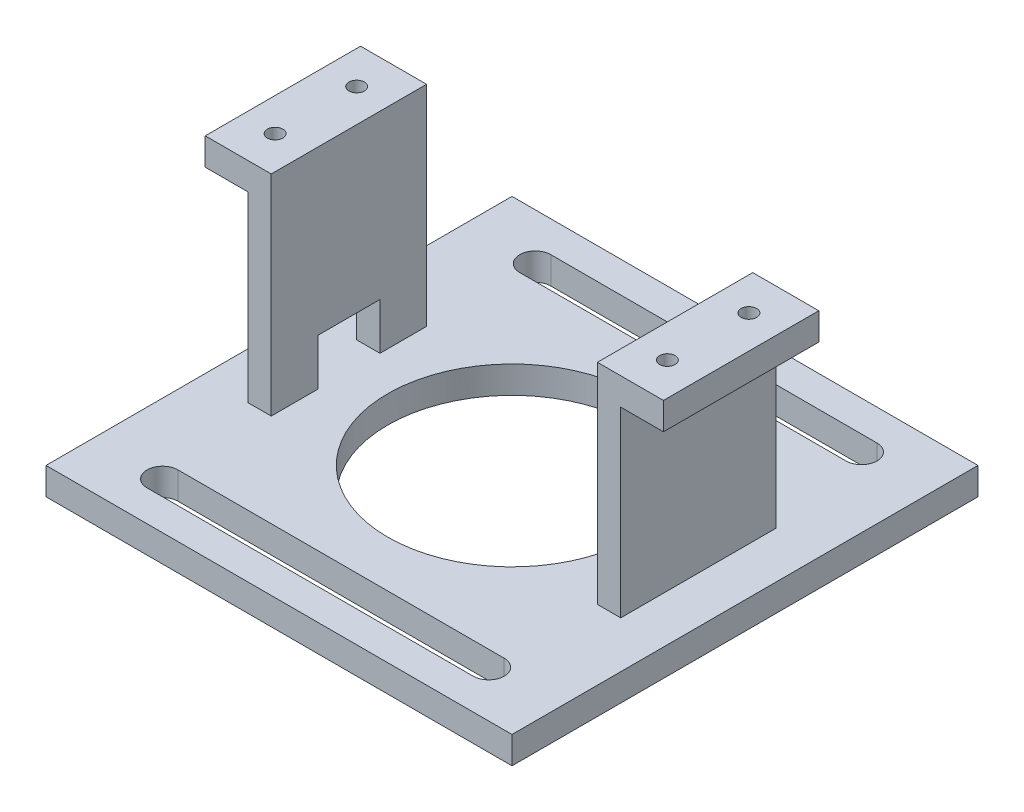
ISO-10303-21;
HEADER;
FILE_DESCRIPTION(('STEP AP214'),'2;1');
FILE_NAME('part.step','',(''),(''),'','','');
FILE_SCHEMA(('AUTOMOTIVE_DESIGN { 1 0 10303 214 1 1 1 1 }'));
ENDSEC;
DATA;
#1=APPLICATION_CONTEXT('core data for automotive mechanical design processes');
#2=APPLICATION_PROTOCOL_DEFINITION('international standard','automotive_design',2000,#1);
#3=PRODUCT_CONTEXT('',#1,'mechanical');
#4=PRODUCT('Part','Part','',(#3));
#5=PRODUCT_RELATED_PRODUCT_CATEGORY('part','',(#4));
#6=PRODUCT_DEFINITION_FORMATION('','',#4);
#7=PRODUCT_DEFINITION_CONTEXT('part definition',#1,'design');
#8=PRODUCT_DEFINITION('design','',#6,#7);
#9=PRODUCT_DEFINITION_SHAPE('','',#8);
#10=(LENGTH_UNIT() NAMED_UNIT(*) SI_UNIT(.MILLI.,.METRE.));
#11=(NAMED_UNIT(*) PLANE_ANGLE_UNIT() SI_UNIT($,.RADIAN.));
#12=(NAMED_UNIT(*) SI_UNIT($,.STERADIAN.) SOLID_ANGLE_UNIT());
#13=UNCERTAINTY_MEASURE_WITH_UNIT(LENGTH_MEASURE(1.E-05),#10,'distance_accuracy_value','');
#14=(GEOMETRIC_REPRESENTATION_CONTEXT(3) GLOBAL_UNCERTAINTY_ASSIGNED_CONTEXT((#13)) GLOBAL_UNIT_ASSIGNED_CONTEXT((#10,
#11,#12)) REPRESENTATION_CONTEXT('',''));
#15=CARTESIAN_POINT('',(0.,0.,0.));
#16=DIRECTION('',(0.,0.,1.));
#17=DIRECTION('',(1.,0.,0.));
#18=AXIS2_PLACEMENT_3D('',#15,#16,#17);
#19=CARTESIAN_POINT('',(-43.5898634281392,30.5,1.31023860830849));
#20=DIRECTION('',(1.,0.,0.));
#21=DIRECTION('',(0.,0.,-1.));
#22=AXIS2_PLACEMENT_3D('',#19,#20,#21);
#23=PLANE('',#22);
#24=DIRECTION('',(0.,0.,1.));
#25=VECTOR('',#24,1.);
#26=CARTESIAN_POINT('',(-43.5898634281392,3.5,1.31023860830849));
#27=LINE('',#26,#25);
#28=CARTESIAN_POINT('',(-43.5898634281392,3.5,-18.6897613916915));
#29=VERTEX_POINT('',#28);
#30=CARTESIAN_POINT('',(-43.5898634281392,3.5,-12.6897613916915));
#31=VERTEX_POINT('',#30);
#32=EDGE_CURVE('E241',#29,#31,#27,.T.);
#33=ORIENTED_EDGE('',*,*,#32,.T.);
#34=DIRECTION('',(0.,-1.,0.));
#35=VECTOR('',#34,1.);
#36=CARTESIAN_POINT('',(-43.5898634281392,9.5,-12.6897613916915));
#37=LINE('',#36,#35);
#38=CARTESIAN_POINT('',(-43.5898634281392,9.5,-12.6897613916915));
#39=VERTEX_POINT('',#38);
#40=EDGE_CURVE('E48',#39,#31,#37,.T.);
#41=ORIENTED_EDGE('',*,*,#40,.F.);
#42=DIRECTION('',(0.,0.,-1.));
#43=VECTOR('',#42,1.);
#44=CARTESIAN_POINT('',(-43.5898634281392,9.5,-4.68976139169151));
#45=LINE('',#44,#43);
#46=CARTESIAN_POINT('',(-43.5898634281392,9.5,-4.68976139169151));
#47=VERTEX_POINT('',#46);
#48=EDGE_CURVE('E234',#47,#39,#45,.T.);
#49=ORIENTED_EDGE('',*,*,#48,.F.);
#50=DIRECTION('',(0.,1.,0.));
#51=VECTOR('',#50,1.);
#52=CARTESIAN_POINT('',(-43.5898634281392,3.5,-4.68976139169151));
#53=LINE('',#52,#51);
#54=CARTESIAN_POINT('',(-43.5898634281392,3.5,-4.68976139169151));
#55=VERTEX_POINT('',#54);
#56=EDGE_CURVE('E220',#55,#47,#53,.T.);
#57=ORIENTED_EDGE('',*,*,#56,.F.);
#58=CARTESIAN_POINT('',(-43.5898634281392,3.5,1.31023860830849));
#59=VERTEX_POINT('',#58);
#60=EDGE_CURVE('E231',#55,#59,#27,.T.);
#61=ORIENTED_EDGE('',*,*,#60,.T.);
#62=DIRECTION('',(0.,-1.,0.));
#63=VECTOR('',#62,1.);
#64=CARTESIAN_POINT('',(-43.5898634281392,30.5,1.31023860830849));
#65=LINE('',#64,#63);
#66=CARTESIAN_POINT('',(-43.5898634281392,27.,1.31023860830849));
#67=VERTEX_POINT('',#66);
#68=EDGE_CURVE('E254',#67,#59,#65,.T.);
#69=ORIENTED_EDGE('',*,*,#68,.F.);
#70=DIRECTION('',(0.,0.,1.));
#71=VECTOR('',#70,1.);
#72=CARTESIAN_POINT('',(-43.5898634281392,27.,-18.6897613916915));
#73=LINE('',#72,#71);
#74=CARTESIAN_POINT('',(-43.5898634281392,27.,-18.6897613916915));
#75=VERTEX_POINT('',#74);
#76=EDGE_CURVE('E319',#75,#67,#73,.T.);
#77=ORIENTED_EDGE('',*,*,#76,.F.);
#78=DIRECTION('',(0.,-1.,0.));
#79=VECTOR('',#78,1.);
#80=CARTESIAN_POINT('',(-43.5898634281392,30.5,-18.6897613916915));
#81=LINE('',#80,#79);
#82=EDGE_CURVE('E257',#75,#29,#81,.T.);
#83=ORIENTED_EDGE('',*,*,#82,.T.);
#84=EDGE_LOOP('',(#33,#41,#49,#57,#61,#69,#77,#83));
#85=FACE_BOUND('',#84,.T.);
#86=ADVANCED_FACE('F33',(#85),#23,.F.);
#87=CARTESIAN_POINT('',(4.41013657186077,30.5,1.31023860830849));
#88=DIRECTION('',(-1.,0.,0.));
#89=DIRECTION('',(0.,0.,1.));
#90=AXIS2_PLACEMENT_3D('',#87,#88,#89);
#91=PLANE('',#90);
#92=DIRECTION('',(0.,0.,-1.));
#93=VECTOR('',#92,1.);
#94=CARTESIAN_POINT('',(4.41013657186077,27.,-18.6897613916915));
#95=LINE('',#94,#93);
#96=CARTESIAN_POINT('',(4.41013657186077,27.,1.31023860830849));
#97=VERTEX_POINT('',#96);
#98=CARTESIAN_POINT('',(4.41013657186077,27.,-18.6897613916915));
#99=VERTEX_POINT('',#98);
#100=EDGE_CURVE('E371',#97,#99,#95,.T.);
#101=ORIENTED_EDGE('',*,*,#100,.F.);
#102=DIRECTION('',(0.,-1.,0.));
#103=VECTOR('',#102,1.);
#104=CARTESIAN_POINT('',(4.41013657186077,30.5,1.31023860830849));
#105=LINE('',#104,#103);
#106=CARTESIAN_POINT('',(4.41013657186077,3.5,1.31023860830849));
#107=VERTEX_POINT('',#106);
#108=EDGE_CURVE('E454',#97,#107,#105,.T.);
#109=ORIENTED_EDGE('',*,*,#108,.T.);
#110=DIRECTION('',(0.,0.,-1.));
#111=VECTOR('',#110,1.);
#112=CARTESIAN_POINT('',(4.41013657186077,3.5,1.31023860830849));
#113=LINE('',#112,#111);
#114=CARTESIAN_POINT('',(4.41013657186077,3.5,-18.6897613916915));
#115=VERTEX_POINT('',#114);
#116=EDGE_CURVE('E445',#107,#115,#113,.T.);
#117=ORIENTED_EDGE('',*,*,#116,.T.);
#118=DIRECTION('',(0.,-1.,0.));
#119=VECTOR('',#118,1.);
#120=CARTESIAN_POINT('',(4.41013657186077,30.5,-18.6897613916915));
#121=LINE('',#120,#119);
#122=EDGE_CURVE('E452',#99,#115,#121,.T.);
#123=ORIENTED_EDGE('',*,*,#122,.F.);
#124=EDGE_LOOP('',(#101,#109,#117,#123));
#125=FACE_BOUND('',#124,.T.);
#126=ADVANCED_FACE('F502',(#125),#91,.F.);
#127=CARTESIAN_POINT('',(0.,3.5,0.));
#128=DIRECTION('',(0.,-1.,0.));
#129=DIRECTION('',(0.,0.,-1.));
#130=AXIS2_PLACEMENT_3D('',#127,#128,#129);
#131=PLANE('',#130);
#132=CARTESIAN_POINT('',(-19.5898634281392,3.5,-8.68976139169152));
#133=DIRECTION('',(0.,1.,0.));
#134=DIRECTION('',(0.,0.,1.));
#135=AXIS2_PLACEMENT_3D('',#132,#133,#134);
#136=CIRCLE('',#135,16.);
#137=CARTESIAN_POINT('',(-19.5898634281392,3.5,7.31023860830848));
#138=VERTEX_POINT('',#137);
#139=EDGE_CURVE('E298',#138,#138,#136,.T.);
#140=ORIENTED_EDGE('',*,*,#139,.F.);
#141=EDGE_LOOP('',(#140));
#142=FACE_BOUND('',#141,.T.);
#143=DIRECTION('',(-1.,0.,0.));
#144=VECTOR('',#143,1.);
#145=CARTESIAN_POINT('',(-33.5898634281392,3.5,-4.68976139169151));
#146=LINE('',#145,#144);
#147=CARTESIAN_POINT('',(-40.5898634281392,3.5,-4.68976139169151));
#148=VERTEX_POINT('',#147);
#149=EDGE_CURVE('E56',#148,#55,#146,.T.);
#150=ORIENTED_EDGE('',*,*,#149,.F.);
#151=DIRECTION('',(0.,0.,-1.));
#152=VECTOR('',#151,1.);
#153=CARTESIAN_POINT('',(-40.5898634281392,3.5,-18.6897613916915));
#154=LINE('',#153,#152);
#155=CARTESIAN_POINT('',(-40.5898634281392,3.5,1.31023860830849));
#156=VERTEX_POINT('',#155);
#157=EDGE_CURVE('E245',#156,#148,#154,.T.);
#158=ORIENTED_EDGE('',*,*,#157,.F.);
#159=DIRECTION('',(1.,0.,0.));
#160=VECTOR('',#159,1.);
#161=CARTESIAN_POINT('',(-40.5898634281392,3.5,1.31023860830849));
#162=LINE('',#161,#160);
#163=EDGE_CURVE('E240',#59,#156,#162,.T.);
#164=ORIENTED_EDGE('',*,*,#163,.F.);
#165=ORIENTED_EDGE('',*,*,#60,.F.);
#166=EDGE_LOOP('',(#150,#158,#164,#165));
#167=FACE_BOUND('',#166,.T.);
#168=DIRECTION('',(-1.,0.,0.));
#169=VECTOR('',#168,1.);
#170=CARTESIAN_POINT('',(-40.5898634281392,3.5,13.3102386083085));
#171=LINE('',#170,#169);
#172=CARTESIAN_POINT('',(1.41013657186077,3.5,13.3102386083085));
#173=VERTEX_POINT('',#172);
#174=CARTESIAN_POINT('',(-40.5898634281392,3.5,13.3102386083085));
#175=VERTEX_POINT('',#174);
#176=EDGE_CURVE('E391',#173,#175,#171,.T.);
#177=ORIENTED_EDGE('',*,*,#176,.F.);
#178=CARTESIAN_POINT('',(1.41013657186077,3.5,15.3102386083085));
#179=DIRECTION('',(0.,1.,0.));
#180=DIRECTION('',(0.,0.,1.));
#181=AXIS2_PLACEMENT_3D('',#178,#179,#180);
#182=CIRCLE('',#181,2.);
#183=CARTESIAN_POINT('',(1.41013657186077,3.5,17.3102386083085));
#184=VERTEX_POINT('',#183);
#185=EDGE_CURVE('E389',#184,#173,#182,.T.);
#186=ORIENTED_EDGE('',*,*,#185,.F.);
#187=DIRECTION('',(1.,0.,0.));
#188=VECTOR('',#187,1.);
#189=CARTESIAN_POINT('',(1.41013657186077,3.5,17.3102386083085));
#190=LINE('',#189,#188);
#191=CARTESIAN_POINT('',(-40.5898634281392,3.5,17.3102386083085));
#192=VERTEX_POINT('',#191);
#193=EDGE_CURVE('E397',#192,#184,#190,.T.);
#194=ORIENTED_EDGE('',*,*,#193,.F.);
#195=CARTESIAN_POINT('',(-40.5898634281392,3.5,15.3102386083085));
#196=DIRECTION('',(0.,1.,0.));
#197=DIRECTION('',(0.,0.,1.));
#198=AXIS2_PLACEMENT_3D('',#195,#196,#197);
#199=CIRCLE('',#198,2.);
#200=EDGE_CURVE('E394',#175,#192,#199,.T.);
#201=ORIENTED_EDGE('',*,*,#200,.F.);
#202=EDGE_LOOP('',(#177,#186,#194,#201));
#203=FACE_BOUND('',#202,.T.);
#204=DIRECTION('',(-1.,0.,0.));
#205=VECTOR('',#204,1.);
#206=CARTESIAN_POINT('',(1.41013657186077,3.5,-34.6897613916915));
#207=LINE('',#206,#205);
#208=CARTESIAN_POINT('',(1.41013657186077,3.5,-34.6897613916915));
#209=VERTEX_POINT('',#208);
#210=CARTESIAN_POINT('',(-40.5898634281392,3.5,-34.6897613916915));
#211=VERTEX_POINT('',#210);
#212=EDGE_CURVE('E411',#209,#211,#207,.T.);
#213=ORIENTED_EDGE('',*,*,#212,.F.);
#214=CARTESIAN_POINT('',(1.41013657186077,3.5,-32.6897613916915));
#215=DIRECTION('',(0.,1.,0.));
#216=DIRECTION('',(0.,0.,1.));
#217=AXIS2_PLACEMENT_3D('',#214,#215,#216);
#218=CIRCLE('',#217,2.);
#219=CARTESIAN_POINT('',(1.41013657186077,3.5,-30.6897613916915));
#220=VERTEX_POINT('',#219);
#221=EDGE_CURVE('E403',#220,#209,#218,.T.);
#222=ORIENTED_EDGE('',*,*,#221,.F.);
#223=DIRECTION('',(1.,0.,0.));
#224=VECTOR('',#223,1.);
#225=CARTESIAN_POINT('',(1.41013657186077,3.5,-30.6897613916915));
#226=LINE('',#225,#224);
#227=CARTESIAN_POINT('',(-40.5898634281392,3.5,-30.6897613916915));
#228=VERTEX_POINT('',#227);
#229=EDGE_CURVE('E417',#228,#220,#226,.T.);
#230=ORIENTED_EDGE('',*,*,#229,.F.);
#231=CARTESIAN_POINT('',(-40.5898634281392,3.5,-32.6897613916915));
#232=DIRECTION('',(0.,1.,0.));
#233=DIRECTION('',(0.,0.,1.));
#234=AXIS2_PLACEMENT_3D('',#231,#232,#233);
#235=CIRCLE('',#234,2.);
#236=EDGE_CURVE('E414',#211,#228,#235,.T.);
#237=ORIENTED_EDGE('',*,*,#236,.F.);
#238=EDGE_LOOP('',(#213,#222,#230,#237));
#239=FACE_BOUND('',#238,.T.);
#240=CARTESIAN_POINT('',(-40.5898634281392,3.5,-12.6897613916915));
#241=VERTEX_POINT('',#240);
#242=CARTESIAN_POINT('',(-40.5898634281392,3.5,-18.6897613916915));
#243=VERTEX_POINT('',#242);
#244=EDGE_CURVE('E459',#241,#243,#154,.T.);
#245=ORIENTED_EDGE('',*,*,#244,.F.);
#246=DIRECTION('',(-1.,0.,0.));
#247=VECTOR('',#246,1.);
#248=CARTESIAN_POINT('',(-33.5898634281392,3.5,-12.6897613916915));
#249=LINE('',#248,#247);
#250=EDGE_CURVE('E226',#241,#31,#249,.T.);
#251=ORIENTED_EDGE('',*,*,#250,.T.);
#252=ORIENTED_EDGE('',*,*,#32,.F.);
#253=DIRECTION('',(-1.,0.,0.));
#254=VECTOR('',#253,1.);
#255=CARTESIAN_POINT('',(-43.5898634281392,3.5,-18.6897613916915));
#256=LINE('',#255,#254);
#257=EDGE_CURVE('E242',#243,#29,#256,.T.);
#258=ORIENTED_EDGE('',*,*,#257,.F.);
#259=EDGE_LOOP('',(#245,#251,#252,#258));
#260=FACE_BOUND('',#259,.T.);
#261=DIRECTION('',(0.,0.,1.));
#262=VECTOR('',#261,1.);
#263=CARTESIAN_POINT('',(10.4101365718608,3.5,-38.6897613916915));
#264=LINE('',#263,#262);
#265=CARTESIAN_POINT('',(10.4101365718608,3.5,-38.6897613916915));
#266=VERTEX_POINT('',#265);
#267=CARTESIAN_POINT('',(10.4101365718608,3.5,21.3102386083085));
#268=VERTEX_POINT('',#267);
#269=EDGE_CURVE('E263',#266,#268,#264,.T.);
#270=ORIENTED_EDGE('',*,*,#269,.F.);
#271=DIRECTION('',(1.,0.,0.));
#272=VECTOR('',#271,1.);
#273=CARTESIAN_POINT('',(-49.5898634281392,3.5,-38.6897613916915));
#274=LINE('',#273,#272);
#275=CARTESIAN_POINT('',(-49.5898634281392,3.5,-38.6897613916915));
#276=VERTEX_POINT('',#275);
#277=EDGE_CURVE('E272',#276,#266,#274,.T.);
#278=ORIENTED_EDGE('',*,*,#277,.F.);
#279=DIRECTION('',(0.,0.,1.));
#280=VECTOR('',#279,1.);
#281=CARTESIAN_POINT('',(-49.5898634281392,3.5,-38.6897613916915));
#282=LINE('',#281,#280);
#283=CARTESIAN_POINT('',(-49.5898634281392,3.5,21.3102386083085));
#284=VERTEX_POINT('',#283);
#285=EDGE_CURVE('E270',#276,#284,#282,.T.);
#286=ORIENTED_EDGE('',*,*,#285,.T.);
#287=DIRECTION('',(-1.,0.,0.));
#288=VECTOR('',#287,1.);
#289=CARTESIAN_POINT('',(10.4101365718608,3.5,21.3102386083085));
#290=LINE('',#289,#288);
#291=EDGE_CURVE('E266',#268,#284,#290,.T.);
#292=ORIENTED_EDGE('',*,*,#291,.F.);
#293=EDGE_LOOP('',(#270,#278,#286,#292));
#294=FACE_BOUND('',#293,.T.);
#295=DIRECTION('',(0.,0.,1.));
#296=VECTOR('',#295,1.);
#297=CARTESIAN_POINT('',(1.41013657186077,3.5,-18.6897613916915));
#298=LINE('',#297,#296);
#299=CARTESIAN_POINT('',(1.41013657186077,3.5,-18.6897613916915));
#300=VERTEX_POINT('',#299);
#301=CARTESIAN_POINT('',(1.41013657186077,3.5,1.31023860830849));
#302=VERTEX_POINT('',#301);
#303=EDGE_CURVE('E297',#300,#302,#298,.T.);
#304=ORIENTED_EDGE('',*,*,#303,.F.);
#305=DIRECTION('',(-1.,0.,0.));
#306=VECTOR('',#305,1.);
#307=CARTESIAN_POINT('',(4.41013657186077,3.5,-18.6897613916915));
#308=LINE('',#307,#306);
#309=EDGE_CURVE('E435',#115,#300,#308,.T.);
#310=ORIENTED_EDGE('',*,*,#309,.F.);
#311=ORIENTED_EDGE('',*,*,#116,.F.);
#312=DIRECTION('',(1.,0.,0.));
#313=VECTOR('',#312,1.);
#314=CARTESIAN_POINT('',(1.41013657186077,3.5,1.31023860830849));
#315=LINE('',#314,#313);
#316=EDGE_CURVE('E442',#302,#107,#315,.T.);
#317=ORIENTED_EDGE('',*,*,#316,.F.);
#318=EDGE_LOOP('',(#304,#310,#311,#317));
#319=FACE_BOUND('',#318,.T.);
#320=ADVANCED_FACE('F237',(#142,#167,#203,#239,#260,#294,#319),#131,.F.);
#321=CARTESIAN_POINT('',(10.4101365718608,3.5,-38.6897613916915));
#322=DIRECTION('',(1.,0.,0.));
#323=DIRECTION('',(0.,0.,-1.));
#324=AXIS2_PLACEMENT_3D('',#321,#322,#323);
#325=PLANE('',#324);
#326=DIRECTION('',(0.,0.,1.));
#327=VECTOR('',#326,1.);
#328=CARTESIAN_POINT('',(10.4101365718608,0.,-38.6897613916915));
#329=LINE('',#328,#327);
#330=CARTESIAN_POINT('',(10.4101365718608,0.,-38.6897613916915));
#331=VERTEX_POINT('',#330);
#332=CARTESIAN_POINT('',(10.4101365718608,0.,21.3102386083085));
#333=VERTEX_POINT('',#332);
#334=EDGE_CURVE('E262',#331,#333,#329,.T.);
#335=ORIENTED_EDGE('',*,*,#334,.F.);
#336=DIRECTION('',(0.,-1.,0.));
#337=VECTOR('',#336,1.);
#338=CARTESIAN_POINT('',(10.4101365718608,3.5,-38.6897613916915));
#339=LINE('',#338,#337);
#340=EDGE_CURVE('E286',#266,#331,#339,.T.);
#341=ORIENTED_EDGE('',*,*,#340,.F.);
#342=ORIENTED_EDGE('',*,*,#269,.T.);
#343=DIRECTION('',(0.,-1.,0.));
#344=VECTOR('',#343,1.);
#345=CARTESIAN_POINT('',(10.4101365718608,3.5,21.3102386083085));
#346=LINE('',#345,#344);
#347=EDGE_CURVE('E275',#268,#333,#346,.T.);
#348=ORIENTED_EDGE('',*,*,#347,.T.);
#349=EDGE_LOOP('',(#335,#341,#342,#348));
#350=FACE_BOUND('',#349,.T.);
#351=ADVANCED_FACE('F35',(#350),#325,.T.);
#352=CARTESIAN_POINT('',(-49.5898634281392,3.5,-38.6897613916915));
#353=DIRECTION('',(0.,0.,-1.));
#354=DIRECTION('',(-1.,0.,0.));
#355=AXIS2_PLACEMENT_3D('',#352,#353,#354);
#356=PLANE('',#355);
#357=DIRECTION('',(1.,0.,0.));
#358=VECTOR('',#357,1.);
#359=CARTESIAN_POINT('',(-49.5898634281392,0.,-38.6897613916915));
#360=LINE('',#359,#358);
#361=CARTESIAN_POINT('',(-49.5898634281392,0.,-38.6897613916915));
#362=VERTEX_POINT('',#361);
#363=EDGE_CURVE('E267',#362,#331,#360,.T.);
#364=ORIENTED_EDGE('',*,*,#363,.F.);
#365=DIRECTION('',(0.,-1.,0.));
#366=VECTOR('',#365,1.);
#367=CARTESIAN_POINT('',(-49.5898634281392,3.5,-38.6897613916915));
#368=LINE('',#367,#366);
#369=EDGE_CURVE('E289',#276,#362,#368,.T.);
#370=ORIENTED_EDGE('',*,*,#369,.F.);
#371=ORIENTED_EDGE('',*,*,#277,.T.);
#372=ORIENTED_EDGE('',*,*,#340,.T.);
#373=EDGE_LOOP('',(#364,#370,#371,#372));
#374=FACE_BOUND('',#373,.T.);
#375=ADVANCED_FACE('F526',(#374),#356,.T.);
#376=CARTESIAN_POINT('',(-49.5898634281392,3.5,-38.6897613916915));
#377=DIRECTION('',(1.,0.,0.));
#378=DIRECTION('',(0.,0.,-1.));
#379=AXIS2_PLACEMENT_3D('',#376,#377,#378);
#380=PLANE('',#379);
#381=DIRECTION('',(0.,0.,1.));
#382=VECTOR('',#381,1.);
#383=CARTESIAN_POINT('',(-49.5898634281392,0.,-38.6897613916915));
#384=LINE('',#383,#382);
#385=CARTESIAN_POINT('',(-49.5898634281392,0.,21.3102386083085));
#386=VERTEX_POINT('',#385);
#387=EDGE_CURVE('E281',#362,#386,#384,.T.);
#388=ORIENTED_EDGE('',*,*,#387,.T.);
#389=DIRECTION('',(0.,-1.,0.));
#390=VECTOR('',#389,1.);
#391=CARTESIAN_POINT('',(-49.5898634281392,3.5,21.3102386083085));
#392=LINE('',#391,#390);
#393=EDGE_CURVE('E291',#284,#386,#392,.T.);
#394=ORIENTED_EDGE('',*,*,#393,.F.);
#395=ORIENTED_EDGE('',*,*,#285,.F.);
#396=ORIENTED_EDGE('',*,*,#369,.T.);
#397=EDGE_LOOP('',(#388,#394,#395,#396));
#398=FACE_BOUND('',#397,.T.);
#399=ADVANCED_FACE('F529',(#398),#380,.F.);
#400=CARTESIAN_POINT('',(10.4101365718608,3.5,21.3102386083085));
#401=DIRECTION('',(0.,0.,1.));
#402=DIRECTION('',(1.,0.,0.));
#403=AXIS2_PLACEMENT_3D('',#400,#401,#402);
#404=PLANE('',#403);
#405=DIRECTION('',(-1.,0.,0.));
#406=VECTOR('',#405,1.);
#407=CARTESIAN_POINT('',(10.4101365718608,0.,21.3102386083085));
#408=LINE('',#407,#406);
#409=EDGE_CURVE('E278',#333,#386,#408,.T.);
#410=ORIENTED_EDGE('',*,*,#409,.F.);
#411=ORIENTED_EDGE('',*,*,#347,.F.);
#412=ORIENTED_EDGE('',*,*,#291,.T.);
#413=ORIENTED_EDGE('',*,*,#393,.T.);
#414=EDGE_LOOP('',(#410,#411,#412,#413));
#415=FACE_BOUND('',#414,.T.);
#416=ADVANCED_FACE('F524',(#415),#404,.T.);
#417=CARTESIAN_POINT('',(0.,0.,0.));
#418=DIRECTION('',(0.,-1.,0.));
#419=DIRECTION('',(0.,0.,-1.));
#420=AXIS2_PLACEMENT_3D('',#417,#418,#419);
#421=PLANE('',#420);
#422=CARTESIAN_POINT('',(1.41013657186077,0.,15.3102386083085));
#423=DIRECTION('',(0.,-1.,0.));
#424=DIRECTION('',(0.,0.,-1.));
#425=AXIS2_PLACEMENT_3D('',#422,#423,#424);
#426=CIRCLE('',#425,2.);
#427=CARTESIAN_POINT('',(1.41013657186077,0.,13.3102386083085));
#428=VERTEX_POINT('',#427);
#429=CARTESIAN_POINT('',(1.41013657186077,0.,17.3102386083085));
#430=VERTEX_POINT('',#429);
#431=EDGE_CURVE('E314',#428,#430,#426,.T.);
#432=ORIENTED_EDGE('',*,*,#431,.F.);
#433=DIRECTION('',(1.,0.,0.));
#434=VECTOR('',#433,1.);
#435=CARTESIAN_POINT('',(0.,0.,13.3102386083085));
#436=LINE('',#435,#434);
#437=CARTESIAN_POINT('',(-40.5898634281392,0.,13.3102386083085));
#438=VERTEX_POINT('',#437);
#439=EDGE_CURVE('E307',#438,#428,#436,.T.);
#440=ORIENTED_EDGE('',*,*,#439,.F.);
#441=CARTESIAN_POINT('',(-40.5898634281392,0.,15.3102386083085));
#442=DIRECTION('',(0.,-1.,0.));
#443=DIRECTION('',(0.,0.,-1.));
#444=AXIS2_PLACEMENT_3D('',#441,#442,#443);
#445=CIRCLE('',#444,2.);
#446=CARTESIAN_POINT('',(-40.5898634281392,0.,17.3102386083085));
#447=VERTEX_POINT('',#446);
#448=EDGE_CURVE('E309',#447,#438,#445,.T.);
#449=ORIENTED_EDGE('',*,*,#448,.F.);
#450=DIRECTION('',(-1.,0.,0.));
#451=VECTOR('',#450,1.);
#452=CARTESIAN_POINT('',(0.,0.,17.3102386083085));
#453=LINE('',#452,#451);
#454=EDGE_CURVE('E312',#430,#447,#453,.T.);
#455=ORIENTED_EDGE('',*,*,#454,.F.);
#456=EDGE_LOOP('',(#432,#440,#449,#455));
#457=FACE_BOUND('',#456,.T.);
#458=CARTESIAN_POINT('',(1.41013657186077,0.,-32.6897613916915));
#459=DIRECTION('',(0.,-1.,0.));
#460=DIRECTION('',(0.,0.,-1.));
#461=AXIS2_PLACEMENT_3D('',#458,#459,#460);
#462=CIRCLE('',#461,2.);
#463=CARTESIAN_POINT('',(1.41013657186077,0.,-34.6897613916915));
#464=VERTEX_POINT('',#463);
#465=CARTESIAN_POINT('',(1.41013657186077,0.,-30.6897613916915));
#466=VERTEX_POINT('',#465);
#467=EDGE_CURVE('E305',#464,#466,#462,.T.);
#468=ORIENTED_EDGE('',*,*,#467,.F.);
#469=DIRECTION('',(1.,0.,0.));
#470=VECTOR('',#469,1.);
#471=CARTESIAN_POINT('',(0.,0.,-34.6897613916915));
#472=LINE('',#471,#470);
#473=CARTESIAN_POINT('',(-40.5898634281392,0.,-34.6897613916915));
#474=VERTEX_POINT('',#473);
#475=EDGE_CURVE('E288',#474,#464,#472,.T.);
#476=ORIENTED_EDGE('',*,*,#475,.F.);
#477=CARTESIAN_POINT('',(-40.5898634281392,0.,-32.6897613916915));
#478=DIRECTION('',(0.,-1.,0.));
#479=DIRECTION('',(0.,0.,-1.));
#480=AXIS2_PLACEMENT_3D('',#477,#478,#479);
#481=CIRCLE('',#480,2.);
#482=CARTESIAN_POINT('',(-40.5898634281392,0.,-30.6897613916915));
#483=VERTEX_POINT('',#482);
#484=EDGE_CURVE('E300',#483,#474,#481,.T.);
#485=ORIENTED_EDGE('',*,*,#484,.F.);
#486=DIRECTION('',(-1.,0.,0.));
#487=VECTOR('',#486,1.);
#488=CARTESIAN_POINT('',(0.,0.,-30.6897613916915));
#489=LINE('',#488,#487);
#490=EDGE_CURVE('E303',#466,#483,#489,.T.);
#491=ORIENTED_EDGE('',*,*,#490,.F.);
#492=EDGE_LOOP('',(#468,#476,#485,#491));
#493=FACE_BOUND('',#492,.T.);
#494=CARTESIAN_POINT('',(-19.5898634281392,0.,-8.68976139169152));
#495=DIRECTION('',(0.,-1.,0.));
#496=DIRECTION('',(0.,0.,-1.));
#497=AXIS2_PLACEMENT_3D('',#494,#495,#496);
#498=CIRCLE('',#497,16.);
#499=CARTESIAN_POINT('',(-19.5898634281392,0.,-24.6897613916915));
#500=VERTEX_POINT('',#499);
#501=EDGE_CURVE('E294',#500,#500,#498,.T.);
#502=ORIENTED_EDGE('',*,*,#501,.F.);
#503=EDGE_LOOP('',(#502));
#504=FACE_BOUND('',#503,.T.);
#505=ORIENTED_EDGE('',*,*,#334,.T.);
#506=ORIENTED_EDGE('',*,*,#409,.T.);
#507=ORIENTED_EDGE('',*,*,#387,.F.);
#508=ORIENTED_EDGE('',*,*,#363,.T.);
#509=EDGE_LOOP('',(#505,#506,#507,#508));
#510=FACE_BOUND('',#509,.T.);
#511=ADVANCED_FACE('F518',(#457,#493,#504,#510),#421,.T.);
#512=CARTESIAN_POINT('',(-40.5898634281392,30.5,-18.6897613916915));
#513=DIRECTION('',(-1.,0.,0.));
#514=DIRECTION('',(0.,0.,1.));
#515=AXIS2_PLACEMENT_3D('',#512,#513,#514);
#516=PLANE('',#515);
#517=DIRECTION('',(0.,0.,-1.));
#518=VECTOR('',#517,1.);
#519=CARTESIAN_POINT('',(-40.5898634281392,9.49999999999999,-18.6897613916915));
#520=LINE('',#519,#518);
#521=CARTESIAN_POINT('',(-40.5898634281392,9.5,-4.68976139169151));
#522=VERTEX_POINT('',#521);
#523=CARTESIAN_POINT('',(-40.5898634281392,9.5,-12.6897613916915));
#524=VERTEX_POINT('',#523);
#525=EDGE_CURVE('E41',#522,#524,#520,.T.);
#526=ORIENTED_EDGE('',*,*,#525,.T.);
#527=DIRECTION('',(0.,-1.,0.));
#528=VECTOR('',#527,1.);
#529=CARTESIAN_POINT('',(-40.5898634281392,30.5,-12.6897613916915));
#530=LINE('',#529,#528);
#531=EDGE_CURVE('E11',#524,#241,#530,.T.);
#532=ORIENTED_EDGE('',*,*,#531,.T.);
#533=ORIENTED_EDGE('',*,*,#244,.T.);
#534=DIRECTION('',(0.,-1.,0.));
#535=VECTOR('',#534,1.);
#536=CARTESIAN_POINT('',(-40.5898634281392,30.5,-18.6897613916915));
#537=LINE('',#536,#535);
#538=CARTESIAN_POINT('',(-40.5898634281392,30.5,-18.6897613916915));
#539=VERTEX_POINT('',#538);
#540=EDGE_CURVE('E259',#539,#243,#537,.T.);
#541=ORIENTED_EDGE('',*,*,#540,.F.);
#542=DIRECTION('',(0.,0.,-1.));
#543=VECTOR('',#542,1.);
#544=CARTESIAN_POINT('',(-40.5898634281392,30.5,-18.6897613916915));
#545=LINE('',#544,#543);
#546=CARTESIAN_POINT('',(-40.5898634281392,30.5,1.31023860830849));
#547=VERTEX_POINT('',#546);
#548=EDGE_CURVE('E250',#547,#539,#545,.T.);
#549=ORIENTED_EDGE('',*,*,#548,.F.);
#550=DIRECTION('',(0.,-1.,0.));
#551=VECTOR('',#550,1.);
#552=CARTESIAN_POINT('',(-40.5898634281392,30.5,1.31023860830849));
#553=LINE('',#552,#551);
#554=EDGE_CURVE('E251',#547,#156,#553,.T.);
#555=ORIENTED_EDGE('',*,*,#554,.T.);
#556=ORIENTED_EDGE('',*,*,#157,.T.);
#557=DIRECTION('',(0.,1.,0.));
#558=VECTOR('',#557,1.);
#559=CARTESIAN_POINT('',(-40.5898634281392,30.5,-4.68976139169151));
#560=LINE('',#559,#558);
#561=EDGE_CURVE('E223',#148,#522,#560,.T.);
#562=ORIENTED_EDGE('',*,*,#561,.T.);
#563=EDGE_LOOP('',(#526,#532,#533,#541,#549,#555,#556,#562));
#564=FACE_BOUND('',#563,.T.);
#565=ADVANCED_FACE('F335',(#564),#516,.F.);
#566=CARTESIAN_POINT('',(-43.5898634281392,30.5,-18.6897613916915));
#567=DIRECTION('',(0.,0.,1.));
#568=DIRECTION('',(1.,0.,0.));
#569=AXIS2_PLACEMENT_3D('',#566,#567,#568);
#570=PLANE('',#569);
#571=ORIENTED_EDGE('',*,*,#257,.T.);
#572=ORIENTED_EDGE('',*,*,#82,.F.);
#573=DIRECTION('',(1.,0.,0.));
#574=VECTOR('',#573,1.);
#575=CARTESIAN_POINT('',(-49.0898634281392,27.,-18.6897613916915));
#576=LINE('',#575,#574);
#577=CARTESIAN_POINT('',(-49.0898634281392,27.,-18.6897613916915));
#578=VERTEX_POINT('',#577);
#579=EDGE_CURVE('E369',#578,#75,#576,.T.);
#580=ORIENTED_EDGE('',*,*,#579,.F.);
#581=DIRECTION('',(0.,-1.,0.));
#582=VECTOR('',#581,1.);
#583=CARTESIAN_POINT('',(-49.0898634281392,30.5,-18.6897613916915));
#584=LINE('',#583,#582);
#585=CARTESIAN_POINT('',(-49.0898634281392,30.5,-18.6897613916915));
#586=VERTEX_POINT('',#585);
#587=EDGE_CURVE('E354',#586,#578,#584,.T.);
#588=ORIENTED_EDGE('',*,*,#587,.F.);
#589=DIRECTION('',(-1.,0.,0.));
#590=VECTOR('',#589,1.);
#591=CARTESIAN_POINT('',(-43.5898634281392,30.5,-18.6897613916915));
#592=LINE('',#591,#590);
#593=EDGE_CURVE('E462',#539,#586,#592,.T.);
#594=ORIENTED_EDGE('',*,*,#593,.F.);
#595=ORIENTED_EDGE('',*,*,#540,.T.);
#596=EDGE_LOOP('',(#571,#572,#580,#588,#594,#595));
#597=FACE_BOUND('',#596,.T.);
#598=ADVANCED_FACE('F472',(#597),#570,.F.);
#599=CARTESIAN_POINT('',(-40.5898634281392,30.5,1.31023860830849));
#600=DIRECTION('',(0.,0.,-1.));
#601=DIRECTION('',(-1.,0.,0.));
#602=AXIS2_PLACEMENT_3D('',#599,#600,#601);
#603=PLANE('',#602);
#604=ORIENTED_EDGE('',*,*,#163,.T.);
#605=ORIENTED_EDGE('',*,*,#554,.F.);
#606=DIRECTION('',(1.,0.,0.));
#607=VECTOR('',#606,1.);
#608=CARTESIAN_POINT('',(-40.5898634281392,30.5,1.31023860830849));
#609=LINE('',#608,#607);
#610=CARTESIAN_POINT('',(-49.0898634281392,30.5,1.31023860830849));
#611=VERTEX_POINT('',#610);
#612=EDGE_CURVE('E255',#611,#547,#609,.T.);
#613=ORIENTED_EDGE('',*,*,#612,.F.);
#614=DIRECTION('',(0.,1.,0.));
#615=VECTOR('',#614,1.);
#616=CARTESIAN_POINT('',(-49.0898634281392,27.,1.31023860830849));
#617=LINE('',#616,#615);
#618=CARTESIAN_POINT('',(-49.0898634281392,27.,1.31023860830849));
#619=VERTEX_POINT('',#618);
#620=EDGE_CURVE('E359',#619,#611,#617,.T.);
#621=ORIENTED_EDGE('',*,*,#620,.F.);
#622=DIRECTION('',(1.,0.,0.));
#623=VECTOR('',#622,1.);
#624=CARTESIAN_POINT('',(-49.0898634281392,27.,1.31023860830849));
#625=LINE('',#624,#623);
#626=EDGE_CURVE('E365',#619,#67,#625,.T.);
#627=ORIENTED_EDGE('',*,*,#626,.T.);
#628=ORIENTED_EDGE('',*,*,#68,.T.);
#629=EDGE_LOOP('',(#604,#605,#613,#621,#627,#628));
#630=FACE_BOUND('',#629,.T.);
#631=ADVANCED_FACE('F480',(#630),#603,.F.);
#632=CARTESIAN_POINT('',(0.,30.5,0.));
#633=DIRECTION('',(0.,-1.,0.));
#634=DIRECTION('',(0.,0.,-1.));
#635=AXIS2_PLACEMENT_3D('',#632,#633,#634);
#636=PLANE('',#635);
#637=CARTESIAN_POINT('',(-44.8398634281392,30.5,-3.43976139169151));
#638=DIRECTION('',(0.,1.,0.));
#639=DIRECTION('',(0.,0.,1.));
#640=AXIS2_PLACEMENT_3D('',#637,#638,#639);
#641=CIRCLE('',#640,0.999999999999998);
#642=CARTESIAN_POINT('',(-44.8398634281392,30.5,-2.43976139169152));
#643=VERTEX_POINT('',#642);
#644=EDGE_CURVE('E324',#643,#643,#641,.T.);
#645=ORIENTED_EDGE('',*,*,#644,.F.);
#646=EDGE_LOOP('',(#645));
#647=FACE_BOUND('',#646,.T.);
#648=CARTESIAN_POINT('',(-44.8398634281392,30.5,-13.9397613916915));
#649=DIRECTION('',(0.,1.,0.));
#650=DIRECTION('',(0.,0.,1.));
#651=AXIS2_PLACEMENT_3D('',#648,#649,#650);
#652=CIRCLE('',#651,0.999999999999998);
#653=CARTESIAN_POINT('',(-44.8398634281392,30.5,-12.9397613916915));
#654=VERTEX_POINT('',#653);
#655=EDGE_CURVE('E320',#654,#654,#652,.T.);
#656=ORIENTED_EDGE('',*,*,#655,.F.);
#657=EDGE_LOOP('',(#656));
#658=FACE_BOUND('',#657,.T.);
#659=ORIENTED_EDGE('',*,*,#548,.T.);
#660=ORIENTED_EDGE('',*,*,#593,.T.);
#661=DIRECTION('',(0.,0.,-1.));
#662=VECTOR('',#661,1.);
#663=CARTESIAN_POINT('',(-49.0898634281392,30.5,1.31023860830849));
#664=LINE('',#663,#662);
#665=EDGE_CURVE('E362',#611,#586,#664,.T.);
#666=ORIENTED_EDGE('',*,*,#665,.F.);
#667=ORIENTED_EDGE('',*,*,#612,.T.);
#668=EDGE_LOOP('',(#659,#660,#666,#667));
#669=FACE_BOUND('',#668,.T.);
#670=ADVANCED_FACE('F477',(#647,#658,#669),#636,.F.);
#671=CARTESIAN_POINT('',(1.41013657186077,30.5,-18.6897613916915));
#672=DIRECTION('',(1.,0.,0.));
#673=DIRECTION('',(0.,0.,-1.));
#674=AXIS2_PLACEMENT_3D('',#671,#672,#673);
#675=PLANE('',#674);
#676=ORIENTED_EDGE('',*,*,#303,.T.);
#677=DIRECTION('',(0.,-1.,0.));
#678=VECTOR('',#677,1.);
#679=CARTESIAN_POINT('',(1.41013657186077,30.5,1.31023860830849));
#680=LINE('',#679,#678);
#681=CARTESIAN_POINT('',(1.41013657186077,30.5,1.31023860830849));
#682=VERTEX_POINT('',#681);
#683=EDGE_CURVE('E456',#682,#302,#680,.T.);
#684=ORIENTED_EDGE('',*,*,#683,.F.);
#685=DIRECTION('',(0.,0.,1.));
#686=VECTOR('',#685,1.);
#687=CARTESIAN_POINT('',(1.41013657186077,30.5,-18.6897613916915));
#688=LINE('',#687,#686);
#689=CARTESIAN_POINT('',(1.41013657186077,30.5,-18.6897613916915));
#690=VERTEX_POINT('',#689);
#691=EDGE_CURVE('E431',#690,#682,#688,.T.);
#692=ORIENTED_EDGE('',*,*,#691,.F.);
#693=DIRECTION('',(0.,-1.,0.));
#694=VECTOR('',#693,1.);
#695=CARTESIAN_POINT('',(1.41013657186077,30.5,-18.6897613916915));
#696=LINE('',#695,#694);
#697=EDGE_CURVE('E439',#690,#300,#696,.T.);
#698=ORIENTED_EDGE('',*,*,#697,.T.);
#699=EDGE_LOOP('',(#676,#684,#692,#698));
#700=FACE_BOUND('',#699,.T.);
#701=ADVANCED_FACE('F558',(#700),#675,.F.);
#702=CARTESIAN_POINT('',(1.41013657186077,30.5,1.31023860830849));
#703=DIRECTION('',(0.,0.,-1.));
#704=DIRECTION('',(-1.,0.,0.));
#705=AXIS2_PLACEMENT_3D('',#702,#703,#704);
#706=PLANE('',#705);
#707=ORIENTED_EDGE('',*,*,#316,.T.);
#708=ORIENTED_EDGE('',*,*,#108,.F.);
#709=DIRECTION('',(-1.,0.,0.));
#710=VECTOR('',#709,1.);
#711=CARTESIAN_POINT('',(9.91013657186077,27.,1.31023860830849));
#712=LINE('',#711,#710);
#713=CARTESIAN_POINT('',(9.91013657186077,27.,1.31023860830849));
#714=VERTEX_POINT('',#713);
#715=EDGE_CURVE('E387',#714,#97,#712,.T.);
#716=ORIENTED_EDGE('',*,*,#715,.F.);
#717=DIRECTION('',(0.,-1.,0.));
#718=VECTOR('',#717,1.);
#719=CARTESIAN_POINT('',(9.91013657186077,27.,1.31023860830849));
#720=LINE('',#719,#718);
#721=CARTESIAN_POINT('',(9.91013657186077,30.5,1.31023860830849));
#722=VERTEX_POINT('',#721);
#723=EDGE_CURVE('E372',#722,#714,#720,.T.);
#724=ORIENTED_EDGE('',*,*,#723,.F.);
#725=DIRECTION('',(1.,0.,0.));
#726=VECTOR('',#725,1.);
#727=CARTESIAN_POINT('',(1.41013657186077,30.5,1.31023860830849));
#728=LINE('',#727,#726);
#729=EDGE_CURVE('E434',#682,#722,#728,.T.);
#730=ORIENTED_EDGE('',*,*,#729,.F.);
#731=ORIENTED_EDGE('',*,*,#683,.T.);
#732=EDGE_LOOP('',(#707,#708,#716,#724,#730,#731));
#733=FACE_BOUND('',#732,.T.);
#734=ADVANCED_FACE('F572',(#733),#706,.F.);
#735=CARTESIAN_POINT('',(4.41013657186077,30.5,-18.6897613916915));
#736=DIRECTION('',(0.,0.,1.));
#737=DIRECTION('',(1.,0.,0.));
#738=AXIS2_PLACEMENT_3D('',#735,#736,#737);
#739=PLANE('',#738);
#740=ORIENTED_EDGE('',*,*,#309,.T.);
#741=ORIENTED_EDGE('',*,*,#697,.F.);
#742=DIRECTION('',(-1.,0.,0.));
#743=VECTOR('',#742,1.);
#744=CARTESIAN_POINT('',(4.41013657186077,30.5,-18.6897613916915));
#745=LINE('',#744,#743);
#746=CARTESIAN_POINT('',(9.91013657186077,30.5,-18.6897613916915));
#747=VERTEX_POINT('',#746);
#748=EDGE_CURVE('E437',#747,#690,#745,.T.);
#749=ORIENTED_EDGE('',*,*,#748,.F.);
#750=DIRECTION('',(0.,1.,0.));
#751=VECTOR('',#750,1.);
#752=CARTESIAN_POINT('',(9.91013657186077,30.5,-18.6897613916915));
#753=LINE('',#752,#751);
#754=CARTESIAN_POINT('',(9.91013657186077,27.,-18.6897613916915));
#755=VERTEX_POINT('',#754);
#756=EDGE_CURVE('E377',#755,#747,#753,.T.);
#757=ORIENTED_EDGE('',*,*,#756,.F.);
#758=DIRECTION('',(-1.,0.,0.));
#759=VECTOR('',#758,1.);
#760=CARTESIAN_POINT('',(9.91013657186077,27.,-18.6897613916915));
#761=LINE('',#760,#759);
#762=EDGE_CURVE('E383',#755,#99,#761,.T.);
#763=ORIENTED_EDGE('',*,*,#762,.T.);
#764=ORIENTED_EDGE('',*,*,#122,.T.);
#765=EDGE_LOOP('',(#740,#741,#749,#757,#763,#764));
#766=FACE_BOUND('',#765,.T.);
#767=ADVANCED_FACE('F555',(#766),#739,.F.);
#768=CARTESIAN_POINT('',(0.,30.5,0.));
#769=DIRECTION('',(0.,1.,0.));
#770=DIRECTION('',(0.,0.,1.));
#771=AXIS2_PLACEMENT_3D('',#768,#769,#770);
#772=PLANE('',#771);
#773=CARTESIAN_POINT('',(5.66013657186077,30.5,-13.9397613916915));
#774=DIRECTION('',(0.,1.,0.));
#775=DIRECTION('',(0.,0.,1.));
#776=AXIS2_PLACEMENT_3D('',#773,#774,#775);
#777=CIRCLE('',#776,1.);
#778=CARTESIAN_POINT('',(5.66013657186077,30.5,-12.9397613916915));
#779=VERTEX_POINT('',#778);
#780=EDGE_CURVE('E332',#779,#779,#777,.T.);
#781=ORIENTED_EDGE('',*,*,#780,.F.);
#782=EDGE_LOOP('',(#781));
#783=FACE_BOUND('',#782,.T.);
#784=CARTESIAN_POINT('',(5.66013657186077,30.5,-3.43976139169152));
#785=DIRECTION('',(0.,1.,0.));
#786=DIRECTION('',(0.,0.,1.));
#787=AXIS2_PLACEMENT_3D('',#784,#785,#786);
#788=CIRCLE('',#787,1.);
#789=CARTESIAN_POINT('',(5.66013657186077,30.5,-2.43976139169152));
#790=VERTEX_POINT('',#789);
#791=EDGE_CURVE('E328',#790,#790,#788,.T.);
#792=ORIENTED_EDGE('',*,*,#791,.F.);
#793=EDGE_LOOP('',(#792));
#794=FACE_BOUND('',#793,.T.);
#795=ORIENTED_EDGE('',*,*,#691,.T.);
#796=ORIENTED_EDGE('',*,*,#729,.T.);
#797=DIRECTION('',(0.,0.,1.));
#798=VECTOR('',#797,1.);
#799=CARTESIAN_POINT('',(9.91013657186077,30.5,1.31023860830849));
#800=LINE('',#799,#798);
#801=EDGE_CURVE('E380',#747,#722,#800,.T.);
#802=ORIENTED_EDGE('',*,*,#801,.F.);
#803=ORIENTED_EDGE('',*,*,#748,.T.);
#804=EDGE_LOOP('',(#795,#796,#802,#803));
#805=FACE_BOUND('',#804,.T.);
#806=ADVANCED_FACE('F560',(#783,#794,#805),#772,.T.);
#807=CARTESIAN_POINT('',(-19.5898634281392,-1.5,-8.68976139169152));
#808=DIRECTION('',(0.,1.,0.));
#809=DIRECTION('',(0.,0.,1.));
#810=AXIS2_PLACEMENT_3D('',#807,#808,#809);
#811=CYLINDRICAL_SURFACE('',#810,16.);
#812=ORIENTED_EDGE('',*,*,#501,.T.);
#813=EDGE_LOOP('',(#812));
#814=FACE_BOUND('',#813,.T.);
#815=ORIENTED_EDGE('',*,*,#139,.T.);
#816=EDGE_LOOP('',(#815));
#817=FACE_BOUND('',#816,.T.);
#818=ADVANCED_FACE('F721',(#814,#817),#811,.F.);
#819=CARTESIAN_POINT('',(1.41013657186077,-1.5,-32.6897613916915));
#820=DIRECTION('',(0.,1.,0.));
#821=DIRECTION('',(0.,0.,1.));
#822=AXIS2_PLACEMENT_3D('',#819,#820,#821);
#823=CYLINDRICAL_SURFACE('',#822,2.);
#824=ORIENTED_EDGE('',*,*,#467,.T.);
#825=DIRECTION('',(0.,1.,0.));
#826=VECTOR('',#825,1.);
#827=CARTESIAN_POINT('',(1.41013657186077,-1.5,-30.6897613916915));
#828=LINE('',#827,#826);
#829=EDGE_CURVE('E421',#466,#220,#828,.T.);
#830=ORIENTED_EDGE('',*,*,#829,.T.);
#831=ORIENTED_EDGE('',*,*,#221,.T.);
#832=DIRECTION('',(0.,1.,0.));
#833=VECTOR('',#832,1.);
#834=CARTESIAN_POINT('',(1.41013657186077,-1.5,-34.6897613916915));
#835=LINE('',#834,#833);
#836=EDGE_CURVE('E420',#464,#209,#835,.T.);
#837=ORIENTED_EDGE('',*,*,#836,.F.);
#838=EDGE_LOOP('',(#824,#830,#831,#837));
#839=FACE_BOUND('',#838,.T.);
#840=ADVANCED_FACE('F806',(#839),#823,.F.);
#841=CARTESIAN_POINT('',(1.41013657186077,-1.5,-30.6897613916915));
#842=DIRECTION('',(0.,0.,1.));
#843=DIRECTION('',(1.,0.,0.));
#844=AXIS2_PLACEMENT_3D('',#841,#842,#843);
#845=PLANE('',#844);
#846=ORIENTED_EDGE('',*,*,#490,.T.);
#847=DIRECTION('',(0.,1.,0.));
#848=VECTOR('',#847,1.);
#849=CARTESIAN_POINT('',(-40.5898634281392,-1.5,-30.6897613916915));
#850=LINE('',#849,#848);
#851=EDGE_CURVE('E423',#483,#228,#850,.T.);
#852=ORIENTED_EDGE('',*,*,#851,.T.);
#853=ORIENTED_EDGE('',*,*,#229,.T.);
#854=ORIENTED_EDGE('',*,*,#829,.F.);
#855=EDGE_LOOP('',(#846,#852,#853,#854));
#856=FACE_BOUND('',#855,.T.);
#857=ADVANCED_FACE('F797',(#856),#845,.F.);
#858=CARTESIAN_POINT('',(-40.5898634281392,-1.5,-32.6897613916915));
#859=DIRECTION('',(0.,1.,0.));
#860=DIRECTION('',(0.,0.,1.));
#861=AXIS2_PLACEMENT_3D('',#858,#859,#860);
#862=CYLINDRICAL_SURFACE('',#861,2.);
#863=ORIENTED_EDGE('',*,*,#484,.T.);
#864=DIRECTION('',(0.,1.,0.));
#865=VECTOR('',#864,1.);
#866=CARTESIAN_POINT('',(-40.5898634281392,-1.5,-34.6897613916915));
#867=LINE('',#866,#865);
#868=EDGE_CURVE('E425',#474,#211,#867,.T.);
#869=ORIENTED_EDGE('',*,*,#868,.T.);
#870=ORIENTED_EDGE('',*,*,#236,.T.);
#871=ORIENTED_EDGE('',*,*,#851,.F.);
#872=EDGE_LOOP('',(#863,#869,#870,#871));
#873=FACE_BOUND('',#872,.T.);
#874=ADVANCED_FACE('F788',(#873),#862,.F.);
#875=CARTESIAN_POINT('',(1.41013657186077,-1.5,-34.6897613916915));
#876=DIRECTION('',(0.,0.,-1.));
#877=DIRECTION('',(-1.,0.,0.));
#878=AXIS2_PLACEMENT_3D('',#875,#876,#877);
#879=PLANE('',#878);
#880=ORIENTED_EDGE('',*,*,#475,.T.);
#881=ORIENTED_EDGE('',*,*,#836,.T.);
#882=ORIENTED_EDGE('',*,*,#212,.T.);
#883=ORIENTED_EDGE('',*,*,#868,.F.);
#884=EDGE_LOOP('',(#880,#881,#882,#883));
#885=FACE_BOUND('',#884,.T.);
#886=ADVANCED_FACE('F779',(#885),#879,.F.);
#887=CARTESIAN_POINT('',(1.41013657186077,-1.5,15.3102386083085));
#888=DIRECTION('',(0.,1.,0.));
#889=DIRECTION('',(0.,0.,1.));
#890=AXIS2_PLACEMENT_3D('',#887,#888,#889);
#891=CYLINDRICAL_SURFACE('',#890,2.);
#892=ORIENTED_EDGE('',*,*,#431,.T.);
#893=DIRECTION('',(0.,1.,0.));
#894=VECTOR('',#893,1.);
#895=CARTESIAN_POINT('',(1.41013657186077,-1.5,17.3102386083085));
#896=LINE('',#895,#894);
#897=EDGE_CURVE('E401',#430,#184,#896,.T.);
#898=ORIENTED_EDGE('',*,*,#897,.T.);
#899=ORIENTED_EDGE('',*,*,#185,.T.);
#900=DIRECTION('',(0.,1.,0.));
#901=VECTOR('',#900,1.);
#902=CARTESIAN_POINT('',(1.41013657186077,-1.5,13.3102386083085));
#903=LINE('',#902,#901);
#904=EDGE_CURVE('E400',#428,#173,#903,.T.);
#905=ORIENTED_EDGE('',*,*,#904,.F.);
#906=EDGE_LOOP('',(#892,#898,#899,#905));
#907=FACE_BOUND('',#906,.T.);
#908=ADVANCED_FACE('F770',(#907),#891,.F.);
#909=CARTESIAN_POINT('',(1.41013657186077,-1.5,17.3102386083085));
#910=DIRECTION('',(0.,0.,1.));
#911=DIRECTION('',(1.,0.,0.));
#912=AXIS2_PLACEMENT_3D('',#909,#910,#911);
#913=PLANE('',#912);
#914=ORIENTED_EDGE('',*,*,#454,.T.);
#915=DIRECTION('',(0.,1.,0.));
#916=VECTOR('',#915,1.);
#917=CARTESIAN_POINT('',(-40.5898634281392,-1.5,17.3102386083085));
#918=LINE('',#917,#916);
#919=EDGE_CURVE('E404',#447,#192,#918,.T.);
#920=ORIENTED_EDGE('',*,*,#919,.T.);
#921=ORIENTED_EDGE('',*,*,#193,.T.);
#922=ORIENTED_EDGE('',*,*,#897,.F.);
#923=EDGE_LOOP('',(#914,#920,#921,#922));
#924=FACE_BOUND('',#923,.T.);
#925=ADVANCED_FACE('F761',(#924),#913,.F.);
#926=CARTESIAN_POINT('',(-40.5898634281392,-1.5,15.3102386083085));
#927=DIRECTION('',(0.,1.,0.));
#928=DIRECTION('',(0.,0.,1.));
#929=AXIS2_PLACEMENT_3D('',#926,#927,#928);
#930=CYLINDRICAL_SURFACE('',#929,2.);
#931=ORIENTED_EDGE('',*,*,#448,.T.);
#932=DIRECTION('',(0.,1.,0.));
#933=VECTOR('',#932,1.);
#934=CARTESIAN_POINT('',(-40.5898634281392,-1.5,13.3102386083085));
#935=LINE('',#934,#933);
#936=EDGE_CURVE('E406',#438,#175,#935,.T.);
#937=ORIENTED_EDGE('',*,*,#936,.T.);
#938=ORIENTED_EDGE('',*,*,#200,.T.);
#939=ORIENTED_EDGE('',*,*,#919,.F.);
#940=EDGE_LOOP('',(#931,#937,#938,#939));
#941=FACE_BOUND('',#940,.T.);
#942=ADVANCED_FACE('F752',(#941),#930,.F.);
#943=CARTESIAN_POINT('',(-40.5898634281392,-1.5,13.3102386083085));
#944=DIRECTION('',(0.,0.,-1.));
#945=DIRECTION('',(-1.,0.,0.));
#946=AXIS2_PLACEMENT_3D('',#943,#944,#945);
#947=PLANE('',#946);
#948=ORIENTED_EDGE('',*,*,#439,.T.);
#949=ORIENTED_EDGE('',*,*,#904,.T.);
#950=ORIENTED_EDGE('',*,*,#176,.T.);
#951=ORIENTED_EDGE('',*,*,#936,.F.);
#952=EDGE_LOOP('',(#948,#949,#950,#951));
#953=FACE_BOUND('',#952,.T.);
#954=ADVANCED_FACE('F712',(#953),#947,.F.);
#955=CARTESIAN_POINT('',(9.91013657186077,27.,-18.6897613916915));
#956=DIRECTION('',(0.,1.,0.));
#957=DIRECTION('',(0.,0.,1.));
#958=AXIS2_PLACEMENT_3D('',#955,#956,#957);
#959=PLANE('',#958);
#960=CARTESIAN_POINT('',(5.66013657186077,27.,-13.9397613916915));
#961=DIRECTION('',(0.,1.,0.));
#962=DIRECTION('',(0.,0.,1.));
#963=AXIS2_PLACEMENT_3D('',#960,#961,#962);
#964=CIRCLE('',#963,1.);
#965=CARTESIAN_POINT('',(5.66013657186077,27.,-12.9397613916915));
#966=VERTEX_POINT('',#965);
#967=EDGE_CURVE('E329',#966,#966,#964,.T.);
#968=ORIENTED_EDGE('',*,*,#967,.T.);
#969=EDGE_LOOP('',(#968));
#970=FACE_BOUND('',#969,.T.);
#971=CARTESIAN_POINT('',(5.66013657186077,27.,-3.43976139169152));
#972=DIRECTION('',(0.,1.,0.));
#973=DIRECTION('',(0.,0.,1.));
#974=AXIS2_PLACEMENT_3D('',#971,#972,#973);
#975=CIRCLE('',#974,1.);
#976=CARTESIAN_POINT('',(5.66013657186077,27.,-2.43976139169152));
#977=VERTEX_POINT('',#976);
#978=EDGE_CURVE('E325',#977,#977,#975,.T.);
#979=ORIENTED_EDGE('',*,*,#978,.T.);
#980=EDGE_LOOP('',(#979));
#981=FACE_BOUND('',#980,.T.);
#982=ORIENTED_EDGE('',*,*,#100,.T.);
#983=ORIENTED_EDGE('',*,*,#762,.F.);
#984=DIRECTION('',(0.,0.,-1.));
#985=VECTOR('',#984,1.);
#986=CARTESIAN_POINT('',(9.91013657186077,27.,-18.6897613916915));
#987=LINE('',#986,#985);
#988=EDGE_CURVE('E375',#714,#755,#987,.T.);
#989=ORIENTED_EDGE('',*,*,#988,.F.);
#990=ORIENTED_EDGE('',*,*,#715,.T.);
#991=EDGE_LOOP('',(#982,#983,#989,#990));
#992=FACE_BOUND('',#991,.T.);
#993=ADVANCED_FACE('F568',(#970,#981,#992),#959,.F.);
#994=CARTESIAN_POINT('',(9.91013657186077,0.,0.));
#995=DIRECTION('',(-1.,0.,0.));
#996=DIRECTION('',(0.,0.,1.));
#997=AXIS2_PLACEMENT_3D('',#994,#995,#996);
#998=PLANE('',#997);
#999=ORIENTED_EDGE('',*,*,#723,.T.);
#1000=ORIENTED_EDGE('',*,*,#988,.T.);
#1001=ORIENTED_EDGE('',*,*,#756,.T.);
#1002=ORIENTED_EDGE('',*,*,#801,.T.);
#1003=EDGE_LOOP('',(#999,#1000,#1001,#1002));
#1004=FACE_BOUND('',#1003,.T.);
#1005=ADVANCED_FACE('F498',(#1004),#998,.F.);
#1006=CARTESIAN_POINT('',(-49.0898634281392,27.,-18.6897613916915));
#1007=DIRECTION('',(0.,1.,0.));
#1008=DIRECTION('',(0.,0.,1.));
#1009=AXIS2_PLACEMENT_3D('',#1006,#1007,#1008);
#1010=PLANE('',#1009);
#1011=CARTESIAN_POINT('',(-44.8398634281392,27.,-3.43976139169151));
#1012=DIRECTION('',(0.,1.,0.));
#1013=DIRECTION('',(0.,0.,1.));
#1014=AXIS2_PLACEMENT_3D('',#1011,#1012,#1013);
#1015=CIRCLE('',#1014,0.999999999999998);
#1016=CARTESIAN_POINT('',(-44.8398634281392,27.,-2.43976139169152));
#1017=VERTEX_POINT('',#1016);
#1018=EDGE_CURVE('E321',#1017,#1017,#1015,.T.);
#1019=ORIENTED_EDGE('',*,*,#1018,.T.);
#1020=EDGE_LOOP('',(#1019));
#1021=FACE_BOUND('',#1020,.T.);
#1022=CARTESIAN_POINT('',(-44.8398634281392,27.,-13.9397613916915));
#1023=DIRECTION('',(0.,1.,0.));
#1024=DIRECTION('',(0.,0.,1.));
#1025=AXIS2_PLACEMENT_3D('',#1022,#1023,#1024);
#1026=CIRCLE('',#1025,0.999999999999998);
#1027=CARTESIAN_POINT('',(-44.8398634281392,27.,-12.9397613916915));
#1028=VERTEX_POINT('',#1027);
#1029=EDGE_CURVE('E316',#1028,#1028,#1026,.T.);
#1030=ORIENTED_EDGE('',*,*,#1029,.T.);
#1031=EDGE_LOOP('',(#1030));
#1032=FACE_BOUND('',#1031,.T.);
#1033=ORIENTED_EDGE('',*,*,#76,.T.);
#1034=ORIENTED_EDGE('',*,*,#626,.F.);
#1035=DIRECTION('',(0.,0.,1.));
#1036=VECTOR('',#1035,1.);
#1037=CARTESIAN_POINT('',(-49.0898634281392,27.,-18.6897613916915));
#1038=LINE('',#1037,#1036);
#1039=EDGE_CURVE('E357',#578,#619,#1038,.T.);
#1040=ORIENTED_EDGE('',*,*,#1039,.F.);
#1041=ORIENTED_EDGE('',*,*,#579,.T.);
#1042=EDGE_LOOP('',(#1033,#1034,#1040,#1041));
#1043=FACE_BOUND('',#1042,.T.);
#1044=ADVANCED_FACE('F485',(#1021,#1032,#1043),#1010,.F.);
#1045=CARTESIAN_POINT('',(-49.0898634281392,0.,0.));
#1046=DIRECTION('',(-1.,0.,0.));
#1047=DIRECTION('',(0.,0.,1.));
#1048=AXIS2_PLACEMENT_3D('',#1045,#1046,#1047);
#1049=PLANE('',#1048);
#1050=ORIENTED_EDGE('',*,*,#587,.T.);
#1051=ORIENTED_EDGE('',*,*,#1039,.T.);
#1052=ORIENTED_EDGE('',*,*,#620,.T.);
#1053=ORIENTED_EDGE('',*,*,#665,.T.);
#1054=EDGE_LOOP('',(#1050,#1051,#1052,#1053));
#1055=FACE_BOUND('',#1054,.T.);
#1056=ADVANCED_FACE('F487',(#1055),#1049,.T.);
#1057=CARTESIAN_POINT('',(-44.8398634281392,25.,-13.9397613916915));
#1058=DIRECTION('',(0.,1.,0.));
#1059=DIRECTION('',(0.,0.,1.));
#1060=AXIS2_PLACEMENT_3D('',#1057,#1058,#1059);
#1061=CYLINDRICAL_SURFACE('',#1060,0.999999999999998);
#1062=ORIENTED_EDGE('',*,*,#655,.T.);
#1063=EDGE_LOOP('',(#1062));
#1064=FACE_BOUND('',#1063,.T.);
#1065=ORIENTED_EDGE('',*,*,#1029,.F.);
#1066=EDGE_LOOP('',(#1065));
#1067=FACE_BOUND('',#1066,.T.);
#1068=ADVANCED_FACE('F489',(#1064,#1067),#1061,.F.);
#1069=CARTESIAN_POINT('',(-44.8398634281392,25.,-3.43976139169151));
#1070=DIRECTION('',(0.,1.,0.));
#1071=DIRECTION('',(0.,0.,1.));
#1072=AXIS2_PLACEMENT_3D('',#1069,#1070,#1071);
#1073=CYLINDRICAL_SURFACE('',#1072,0.999999999999998);
#1074=ORIENTED_EDGE('',*,*,#644,.T.);
#1075=EDGE_LOOP('',(#1074));
#1076=FACE_BOUND('',#1075,.T.);
#1077=ORIENTED_EDGE('',*,*,#1018,.F.);
#1078=EDGE_LOOP('',(#1077));
#1079=FACE_BOUND('',#1078,.T.);
#1080=ADVANCED_FACE('F495',(#1076,#1079),#1073,.F.);
#1081=CARTESIAN_POINT('',(5.66013657186077,25.,-3.43976139169152));
#1082=DIRECTION('',(0.,1.,0.));
#1083=DIRECTION('',(0.,0.,1.));
#1084=AXIS2_PLACEMENT_3D('',#1081,#1082,#1083);
#1085=CYLINDRICAL_SURFACE('',#1084,1.);
#1086=ORIENTED_EDGE('',*,*,#791,.T.);
#1087=EDGE_LOOP('',(#1086));
#1088=FACE_BOUND('',#1087,.T.);
#1089=ORIENTED_EDGE('',*,*,#978,.F.);
#1090=EDGE_LOOP('',(#1089));
#1091=FACE_BOUND('',#1090,.T.);
#1092=ADVANCED_FACE('F595',(#1088,#1091),#1085,.F.);
#1093=CARTESIAN_POINT('',(5.66013657186077,25.,-13.9397613916915));
#1094=DIRECTION('',(0.,1.,0.));
#1095=DIRECTION('',(0.,0.,1.));
#1096=AXIS2_PLACEMENT_3D('',#1093,#1094,#1095);
#1097=CYLINDRICAL_SURFACE('',#1096,1.);
#1098=ORIENTED_EDGE('',*,*,#780,.T.);
#1099=EDGE_LOOP('',(#1098));
#1100=FACE_BOUND('',#1099,.T.);
#1101=ORIENTED_EDGE('',*,*,#967,.F.);
#1102=EDGE_LOOP('',(#1101));
#1103=FACE_BOUND('',#1102,.T.);
#1104=ADVANCED_FACE('F601',(#1100,#1103),#1097,.F.);
#1105=CARTESIAN_POINT('',(-33.5898634281392,9.5,-12.6897613916915));
#1106=DIRECTION('',(0.,0.,-1.));
#1107=DIRECTION('',(-1.,0.,0.));
#1108=AXIS2_PLACEMENT_3D('',#1105,#1106,#1107);
#1109=PLANE('',#1108);
#1110=DIRECTION('',(-1.,0.,0.));
#1111=VECTOR('',#1110,1.);
#1112=CARTESIAN_POINT('',(-33.5898634281392,9.5,-12.6897613916915));
#1113=LINE('',#1112,#1111);
#1114=EDGE_CURVE('E340',#524,#39,#1113,.T.);
#1115=ORIENTED_EDGE('',*,*,#1114,.T.);
#1116=ORIENTED_EDGE('',*,*,#40,.T.);
#1117=ORIENTED_EDGE('',*,*,#250,.F.);
#1118=ORIENTED_EDGE('',*,*,#531,.F.);
#1119=EDGE_LOOP('',(#1115,#1116,#1117,#1118));
#1120=FACE_BOUND('',#1119,.T.);
#1121=ADVANCED_FACE('F607',(#1120),#1109,.F.);
#1122=CARTESIAN_POINT('',(-33.5898634281392,9.5,-4.68976139169151));
#1123=DIRECTION('',(0.,1.,0.));
#1124=DIRECTION('',(0.,0.,1.));
#1125=AXIS2_PLACEMENT_3D('',#1122,#1123,#1124);
#1126=PLANE('',#1125);
#1127=DIRECTION('',(-1.,0.,0.));
#1128=VECTOR('',#1127,1.);
#1129=CARTESIAN_POINT('',(-33.5898634281392,9.5,-4.68976139169151));
#1130=LINE('',#1129,#1128);
#1131=EDGE_CURVE('E225',#522,#47,#1130,.T.);
#1132=ORIENTED_EDGE('',*,*,#1131,.T.);
#1133=ORIENTED_EDGE('',*,*,#48,.T.);
#1134=ORIENTED_EDGE('',*,*,#1114,.F.);
#1135=ORIENTED_EDGE('',*,*,#525,.F.);
#1136=EDGE_LOOP('',(#1132,#1133,#1134,#1135));
#1137=FACE_BOUND('',#1136,.T.);
#1138=ADVANCED_FACE('F339',(#1137),#1126,.F.);
#1139=CARTESIAN_POINT('',(-33.5898634281392,3.5,-4.68976139169151));
#1140=DIRECTION('',(0.,0.,1.));
#1141=DIRECTION('',(1.,0.,0.));
#1142=AXIS2_PLACEMENT_3D('',#1139,#1140,#1141);
#1143=PLANE('',#1142);
#1144=ORIENTED_EDGE('',*,*,#149,.T.);
#1145=ORIENTED_EDGE('',*,*,#56,.T.);
#1146=ORIENTED_EDGE('',*,*,#1131,.F.);
#1147=ORIENTED_EDGE('',*,*,#561,.F.);
#1148=EDGE_LOOP('',(#1144,#1145,#1146,#1147));
#1149=FACE_BOUND('',#1148,.T.);
#1150=ADVANCED_FACE('F218',(#1149),#1143,.F.);
#1151=CLOSED_SHELL('',(#86,#126,#320,#351,#375,#399,#416,#511,#565,#598,#631,#670,#701,#734,
#767,#806,#818,#840,#857,#874,#886,#908,#925,#942,#954,#993,#1005,#1044,#1056,#1068,#1080,#1092,
#1104,#1121,#1138,#1150));
#1152=MANIFOLD_SOLID_BREP('B2',#1151);
#1153=ADVANCED_BREP_SHAPE_REPRESENTATION('',(#18,#1152),#14);
#1154=SHAPE_DEFINITION_REPRESENTATION(#9,#1153);
ENDSEC;
END-ISO-10303-21;
